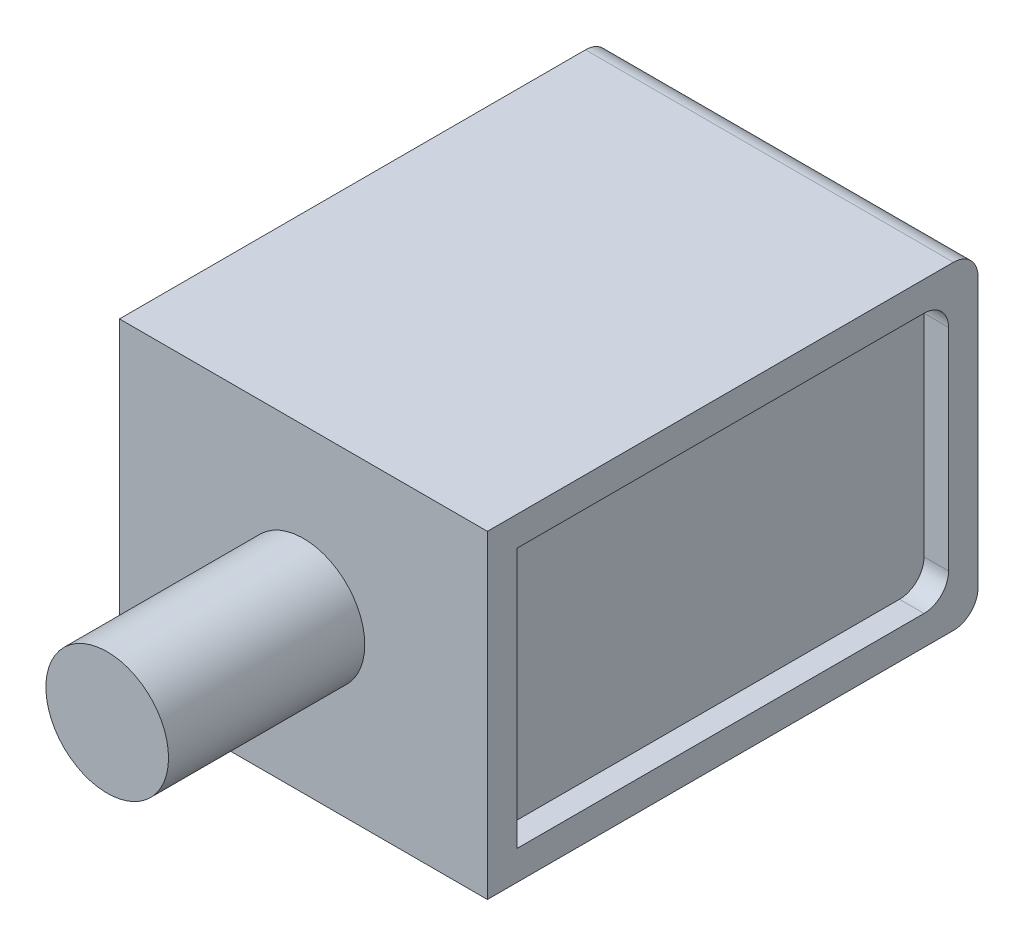
ISO-10303-21;
HEADER;
FILE_DESCRIPTION(('STEP AP214'),'2;1');
FILE_NAME('part.step','',(''),(''),'','','');
FILE_SCHEMA(('AUTOMOTIVE_DESIGN { 1 0 10303 214 1 1 1 1 }'));
ENDSEC;
DATA;
#1=APPLICATION_CONTEXT('core data for automotive mechanical design processes');
#2=APPLICATION_PROTOCOL_DEFINITION('international standard','automotive_design',2000,#1);
#3=PRODUCT_CONTEXT('',#1,'mechanical');
#4=PRODUCT('Part','Part','',(#3));
#5=PRODUCT_RELATED_PRODUCT_CATEGORY('part','',(#4));
#6=PRODUCT_DEFINITION_FORMATION('','',#4);
#7=PRODUCT_DEFINITION_CONTEXT('part definition',#1,'design');
#8=PRODUCT_DEFINITION('design','',#6,#7);
#9=PRODUCT_DEFINITION_SHAPE('','',#8);
#10=(LENGTH_UNIT() NAMED_UNIT(*) SI_UNIT(.MILLI.,.METRE.));
#11=(NAMED_UNIT(*) PLANE_ANGLE_UNIT() SI_UNIT($,.RADIAN.));
#12=(NAMED_UNIT(*) SI_UNIT($,.STERADIAN.) SOLID_ANGLE_UNIT());
#13=UNCERTAINTY_MEASURE_WITH_UNIT(LENGTH_MEASURE(1.E-05),#10,'distance_accuracy_value','');
#14=(GEOMETRIC_REPRESENTATION_CONTEXT(3) GLOBAL_UNCERTAINTY_ASSIGNED_CONTEXT((#13)) GLOBAL_UNIT_ASSIGNED_CONTEXT((#10,
#11,#12)) REPRESENTATION_CONTEXT('',''));
#15=CARTESIAN_POINT('',(0.,0.,0.));
#16=DIRECTION('',(0.,0.,1.));
#17=DIRECTION('',(1.,0.,0.));
#18=AXIS2_PLACEMENT_3D('',#15,#16,#17);
#19=CARTESIAN_POINT('',(-7.5,-6.5,10.));
#20=DIRECTION('',(1.,0.,0.));
#21=DIRECTION('',(0.,1.,0.));
#22=AXIS2_PLACEMENT_3D('',#19,#20,#21);
#23=PLANE('',#22);
#24=DIRECTION('',(0.,-1.,0.));
#25=VECTOR('',#24,1.);
#26=CARTESIAN_POINT('',(-7.5,-6.5,-10.));
#27=LINE('',#26,#25);
#28=CARTESIAN_POINT('',(-7.5,5.5,-10.));
#29=VERTEX_POINT('',#28);
#30=CARTESIAN_POINT('',(-7.5,-5.5,-10.));
#31=VERTEX_POINT('',#30);
#32=EDGE_CURVE('E230',#29,#31,#27,.T.);
#33=ORIENTED_EDGE('',*,*,#32,.T.);
#34=CARTESIAN_POINT('',(-7.5,-5.5,-9.));
#35=DIRECTION('',(1.,0.,0.));
#36=DIRECTION('',(0.,1.,0.));
#37=AXIS2_PLACEMENT_3D('',#34,#35,#36);
#38=CIRCLE('',#37,1.);
#39=CARTESIAN_POINT('',(-7.5,-6.5,-9.));
#40=VERTEX_POINT('',#39);
#41=EDGE_CURVE('E272',#31,#40,#38,.F.);
#42=ORIENTED_EDGE('',*,*,#41,.T.);
#43=DIRECTION('',(0.,0.,-1.));
#44=VECTOR('',#43,1.);
#45=CARTESIAN_POINT('',(-7.5,-6.5,10.));
#46=LINE('',#45,#44);
#47=CARTESIAN_POINT('',(-7.5,-6.5,10.));
#48=VERTEX_POINT('',#47);
#49=EDGE_CURVE('E256',#48,#40,#46,.T.);
#50=ORIENTED_EDGE('',*,*,#49,.F.);
#51=DIRECTION('',(0.,-1.,0.));
#52=VECTOR('',#51,1.);
#53=CARTESIAN_POINT('',(-7.5,-6.5,10.));
#54=LINE('',#53,#52);
#55=CARTESIAN_POINT('',(-7.5,6.5,10.));
#56=VERTEX_POINT('',#55);
#57=EDGE_CURVE('E233',#56,#48,#54,.T.);
#58=ORIENTED_EDGE('',*,*,#57,.F.);
#59=DIRECTION('',(0.,0.,-1.));
#60=VECTOR('',#59,1.);
#61=CARTESIAN_POINT('',(-7.5,6.5,10.));
#62=LINE('',#61,#60);
#63=CARTESIAN_POINT('',(-7.5,6.5,-9.));
#64=VERTEX_POINT('',#63);
#65=EDGE_CURVE('E243',#56,#64,#62,.T.);
#66=ORIENTED_EDGE('',*,*,#65,.T.);
#67=CARTESIAN_POINT('',(-7.5,5.5,-9.));
#68=DIRECTION('',(1.,0.,0.));
#69=DIRECTION('',(0.,1.,0.));
#70=AXIS2_PLACEMENT_3D('',#67,#68,#69);
#71=CIRCLE('',#70,1.);
#72=EDGE_CURVE('E270',#64,#29,#71,.F.);
#73=ORIENTED_EDGE('',*,*,#72,.T.);
#74=EDGE_LOOP('',(#33,#42,#50,#58,#66,#73));
#75=FACE_BOUND('',#74,.T.);
#76=DIRECTION('',(0.,0.,-1.));
#77=VECTOR('',#76,1.);
#78=CARTESIAN_POINT('',(-7.5,-5.3,8.8));
#79=LINE('',#78,#77);
#80=CARTESIAN_POINT('',(-7.5,-5.3,8.8));
#81=VERTEX_POINT('',#80);
#82=CARTESIAN_POINT('',(-7.5,-5.3,-7.8));
#83=VERTEX_POINT('',#82);
#84=EDGE_CURVE('E183',#81,#83,#79,.T.);
#85=ORIENTED_EDGE('',*,*,#84,.T.);
#86=CARTESIAN_POINT('',(-7.5,-4.3,-7.8));
#87=DIRECTION('',(1.,0.,0.));
#88=DIRECTION('',(0.,1.,0.));
#89=AXIS2_PLACEMENT_3D('',#86,#87,#88);
#90=CIRCLE('',#89,1.);
#91=CARTESIAN_POINT('',(-7.5,-4.3,-8.8));
#92=VERTEX_POINT('',#91);
#93=EDGE_CURVE('E305',#83,#92,#90,.T.);
#94=ORIENTED_EDGE('',*,*,#93,.T.);
#95=DIRECTION('',(0.,1.,0.));
#96=VECTOR('',#95,1.);
#97=CARTESIAN_POINT('',(-7.5,-5.3,-8.8));
#98=LINE('',#97,#96);
#99=CARTESIAN_POINT('',(-7.5,4.3,-8.8));
#100=VERTEX_POINT('',#99);
#101=EDGE_CURVE('E197',#92,#100,#98,.T.);
#102=ORIENTED_EDGE('',*,*,#101,.T.);
#103=CARTESIAN_POINT('',(-7.5,4.3,-7.8));
#104=DIRECTION('',(1.,0.,0.));
#105=DIRECTION('',(0.,1.,0.));
#106=AXIS2_PLACEMENT_3D('',#103,#104,#105);
#107=CIRCLE('',#106,1.);
#108=CARTESIAN_POINT('',(-7.5,5.3,-7.8));
#109=VERTEX_POINT('',#108);
#110=EDGE_CURVE('E43',#100,#109,#107,.T.);
#111=ORIENTED_EDGE('',*,*,#110,.T.);
#112=DIRECTION('',(0.,0.,1.));
#113=VECTOR('',#112,1.);
#114=CARTESIAN_POINT('',(-7.5,5.3,-8.8));
#115=LINE('',#114,#113);
#116=CARTESIAN_POINT('',(-7.5,5.3,8.8));
#117=VERTEX_POINT('',#116);
#118=EDGE_CURVE('E193',#109,#117,#115,.T.);
#119=ORIENTED_EDGE('',*,*,#118,.T.);
#120=DIRECTION('',(0.,-1.,0.));
#121=VECTOR('',#120,1.);
#122=CARTESIAN_POINT('',(-7.5,5.3,8.8));
#123=LINE('',#122,#121);
#124=EDGE_CURVE('E201',#117,#81,#123,.T.);
#125=ORIENTED_EDGE('',*,*,#124,.T.);
#126=EDGE_LOOP('',(#85,#94,#102,#111,#119,#125));
#127=FACE_BOUND('',#126,.T.);
#128=ADVANCED_FACE('F39',(#75,#127),#23,.F.);
#129=CARTESIAN_POINT('',(7.5,-6.5,10.));
#130=DIRECTION('',(0.,1.,0.));
#131=DIRECTION('',(-1.,0.,0.));
#132=AXIS2_PLACEMENT_3D('',#129,#130,#131);
#133=PLANE('',#132);
#134=ORIENTED_EDGE('',*,*,#49,.T.);
#135=DIRECTION('',(1.,0.,0.));
#136=VECTOR('',#135,1.);
#137=CARTESIAN_POINT('',(7.5,-6.5,-9.));
#138=LINE('',#137,#136);
#139=CARTESIAN_POINT('',(7.5,-6.5,-9.));
#140=VERTEX_POINT('',#139);
#141=EDGE_CURVE('E259',#40,#140,#138,.T.);
#142=ORIENTED_EDGE('',*,*,#141,.T.);
#143=DIRECTION('',(0.,0.,-1.));
#144=VECTOR('',#143,1.);
#145=CARTESIAN_POINT('',(7.5,-6.5,10.));
#146=LINE('',#145,#144);
#147=CARTESIAN_POINT('',(7.5,-6.5,10.));
#148=VERTEX_POINT('',#147);
#149=EDGE_CURVE('E253',#148,#140,#146,.T.);
#150=ORIENTED_EDGE('',*,*,#149,.F.);
#151=DIRECTION('',(1.,0.,0.));
#152=VECTOR('',#151,1.);
#153=CARTESIAN_POINT('',(7.5,-6.5,10.));
#154=LINE('',#153,#152);
#155=EDGE_CURVE('E236',#48,#148,#154,.T.);
#156=ORIENTED_EDGE('',*,*,#155,.F.);
#157=EDGE_LOOP('',(#134,#142,#150,#156));
#158=FACE_BOUND('',#157,.T.);
#159=ADVANCED_FACE('F323',(#158),#133,.F.);
#160=CARTESIAN_POINT('',(7.5,-6.5,10.));
#161=DIRECTION('',(-1.,0.,0.));
#162=DIRECTION('',(0.,0.,1.));
#163=AXIS2_PLACEMENT_3D('',#160,#161,#162);
#164=PLANE('',#163);
#165=DIRECTION('',(0.,0.,1.));
#166=VECTOR('',#165,1.);
#167=CARTESIAN_POINT('',(7.5,5.3,-8.8));
#168=LINE('',#167,#166);
#169=CARTESIAN_POINT('',(7.5,5.3,-7.8));
#170=VERTEX_POINT('',#169);
#171=CARTESIAN_POINT('',(7.5,5.3,8.8));
#172=VERTEX_POINT('',#171);
#173=EDGE_CURVE('E221',#170,#172,#168,.T.);
#174=ORIENTED_EDGE('',*,*,#173,.F.);
#175=CARTESIAN_POINT('',(7.5,4.3,-7.8));
#176=DIRECTION('',(-1.,0.,0.));
#177=DIRECTION('',(0.,0.,1.));
#178=AXIS2_PLACEMENT_3D('',#175,#176,#177);
#179=CIRCLE('',#178,1.);
#180=CARTESIAN_POINT('',(7.5,4.3,-8.8));
#181=VERTEX_POINT('',#180);
#182=EDGE_CURVE('E293',#170,#181,#179,.T.);
#183=ORIENTED_EDGE('',*,*,#182,.T.);
#184=DIRECTION('',(0.,1.,0.));
#185=VECTOR('',#184,1.);
#186=CARTESIAN_POINT('',(7.5,-5.3,-8.8));
#187=LINE('',#186,#185);
#188=CARTESIAN_POINT('',(7.5,-4.3,-8.8));
#189=VERTEX_POINT('',#188);
#190=EDGE_CURVE('E204',#189,#181,#187,.T.);
#191=ORIENTED_EDGE('',*,*,#190,.F.);
#192=CARTESIAN_POINT('',(7.5,-4.3,-7.8));
#193=DIRECTION('',(-1.,0.,0.));
#194=DIRECTION('',(0.,0.,1.));
#195=AXIS2_PLACEMENT_3D('',#192,#193,#194);
#196=CIRCLE('',#195,1.);
#197=CARTESIAN_POINT('',(7.5,-5.3,-7.8));
#198=VERTEX_POINT('',#197);
#199=EDGE_CURVE('E291',#189,#198,#196,.T.);
#200=ORIENTED_EDGE('',*,*,#199,.T.);
#201=DIRECTION('',(0.,0.,-1.));
#202=VECTOR('',#201,1.);
#203=CARTESIAN_POINT('',(7.5,-5.3,8.8));
#204=LINE('',#203,#202);
#205=CARTESIAN_POINT('',(7.5,-5.3,8.8));
#206=VERTEX_POINT('',#205);
#207=EDGE_CURVE('E210',#206,#198,#204,.T.);
#208=ORIENTED_EDGE('',*,*,#207,.F.);
#209=DIRECTION('',(0.,-1.,0.));
#210=VECTOR('',#209,1.);
#211=CARTESIAN_POINT('',(7.5,5.3,8.8));
#212=LINE('',#211,#210);
#213=EDGE_CURVE('E223',#172,#206,#212,.T.);
#214=ORIENTED_EDGE('',*,*,#213,.F.);
#215=EDGE_LOOP('',(#174,#183,#191,#200,#208,#214));
#216=FACE_BOUND('',#215,.T.);
#217=ORIENTED_EDGE('',*,*,#149,.T.);
#218=CARTESIAN_POINT('',(7.5,-5.5,-9.));
#219=DIRECTION('',(-1.,0.,0.));
#220=DIRECTION('',(0.,0.,1.));
#221=AXIS2_PLACEMENT_3D('',#218,#219,#220);
#222=CIRCLE('',#221,1.);
#223=CARTESIAN_POINT('',(7.5,-5.5,-10.));
#224=VERTEX_POINT('',#223);
#225=EDGE_CURVE('E264',#140,#224,#222,.F.);
#226=ORIENTED_EDGE('',*,*,#225,.T.);
#227=DIRECTION('',(0.,1.,0.));
#228=VECTOR('',#227,1.);
#229=CARTESIAN_POINT('',(7.5,-6.5,-10.));
#230=LINE('',#229,#228);
#231=CARTESIAN_POINT('',(7.5,5.5,-10.));
#232=VERTEX_POINT('',#231);
#233=EDGE_CURVE('E237',#224,#232,#230,.T.);
#234=ORIENTED_EDGE('',*,*,#233,.T.);
#235=CARTESIAN_POINT('',(7.5,5.5,-9.));
#236=DIRECTION('',(-1.,0.,0.));
#237=DIRECTION('',(0.,0.,1.));
#238=AXIS2_PLACEMENT_3D('',#235,#236,#237);
#239=CIRCLE('',#238,1.);
#240=CARTESIAN_POINT('',(7.5,6.5,-9.));
#241=VERTEX_POINT('',#240);
#242=EDGE_CURVE('E262',#232,#241,#239,.F.);
#243=ORIENTED_EDGE('',*,*,#242,.T.);
#244=DIRECTION('',(0.,0.,-1.));
#245=VECTOR('',#244,1.);
#246=CARTESIAN_POINT('',(7.5,6.5,10.));
#247=LINE('',#246,#245);
#248=CARTESIAN_POINT('',(7.5,6.5,10.));
#249=VERTEX_POINT('',#248);
#250=EDGE_CURVE('E250',#249,#241,#247,.T.);
#251=ORIENTED_EDGE('',*,*,#250,.F.);
#252=DIRECTION('',(0.,1.,0.));
#253=VECTOR('',#252,1.);
#254=CARTESIAN_POINT('',(7.5,-6.5,10.));
#255=LINE('',#254,#253);
#256=EDGE_CURVE('E239',#148,#249,#255,.T.);
#257=ORIENTED_EDGE('',*,*,#256,.F.);
#258=EDGE_LOOP('',(#217,#226,#234,#243,#251,#257));
#259=FACE_BOUND('',#258,.T.);
#260=ADVANCED_FACE('F329',(#216,#259),#164,.F.);
#261=CARTESIAN_POINT('',(7.5,6.5,10.));
#262=DIRECTION('',(0.,-1.,0.));
#263=DIRECTION('',(1.,0.,0.));
#264=AXIS2_PLACEMENT_3D('',#261,#262,#263);
#265=PLANE('',#264);
#266=ORIENTED_EDGE('',*,*,#250,.T.);
#267=DIRECTION('',(-1.,0.,0.));
#268=VECTOR('',#267,1.);
#269=CARTESIAN_POINT('',(7.5,6.5,-9.));
#270=LINE('',#269,#268);
#271=EDGE_CURVE('E274',#241,#64,#270,.T.);
#272=ORIENTED_EDGE('',*,*,#271,.T.);
#273=ORIENTED_EDGE('',*,*,#65,.F.);
#274=DIRECTION('',(-1.,0.,0.));
#275=VECTOR('',#274,1.);
#276=CARTESIAN_POINT('',(7.5,6.5,10.));
#277=LINE('',#276,#275);
#278=EDGE_CURVE('E241',#249,#56,#277,.T.);
#279=ORIENTED_EDGE('',*,*,#278,.F.);
#280=EDGE_LOOP('',(#266,#272,#273,#279));
#281=FACE_BOUND('',#280,.T.);
#282=ADVANCED_FACE('F382',(#281),#265,.F.);
#283=CARTESIAN_POINT('',(0.,0.,10.));
#284=DIRECTION('',(0.,0.,1.));
#285=DIRECTION('',(1.,0.,0.));
#286=AXIS2_PLACEMENT_3D('',#283,#284,#285);
#287=PLANE('',#286);
#288=CARTESIAN_POINT('',(0.,0.,10.));
#289=DIRECTION('',(0.,0.,1.));
#290=DIRECTION('',(1.,0.,0.));
#291=AXIS2_PLACEMENT_3D('',#288,#289,#290);
#292=CIRCLE('',#291,2.5);
#293=CARTESIAN_POINT('',(2.5,0.,10.));
#294=VERTEX_POINT('',#293);
#295=EDGE_CURVE('E11',#294,#294,#292,.T.);
#296=ORIENTED_EDGE('',*,*,#295,.F.);
#297=EDGE_LOOP('',(#296));
#298=FACE_BOUND('',#297,.T.);
#299=ORIENTED_EDGE('',*,*,#57,.T.);
#300=ORIENTED_EDGE('',*,*,#155,.T.);
#301=ORIENTED_EDGE('',*,*,#256,.T.);
#302=ORIENTED_EDGE('',*,*,#278,.T.);
#303=EDGE_LOOP('',(#299,#300,#301,#302));
#304=FACE_BOUND('',#303,.T.);
#305=ADVANCED_FACE('F401',(#298,#304),#287,.T.);
#306=CARTESIAN_POINT('',(0.,0.,-10.));
#307=DIRECTION('',(0.,0.,1.));
#308=DIRECTION('',(1.,0.,0.));
#309=AXIS2_PLACEMENT_3D('',#306,#307,#308);
#310=PLANE('',#309);
#311=ORIENTED_EDGE('',*,*,#233,.F.);
#312=DIRECTION('',(1.,0.,0.));
#313=VECTOR('',#312,1.);
#314=CARTESIAN_POINT('',(0.,-5.5,-10.));
#315=LINE('',#314,#313);
#316=EDGE_CURVE('E268',#224,#31,#315,.F.);
#317=ORIENTED_EDGE('',*,*,#316,.T.);
#318=ORIENTED_EDGE('',*,*,#32,.F.);
#319=DIRECTION('',(-1.,0.,0.));
#320=VECTOR('',#319,1.);
#321=CARTESIAN_POINT('',(0.,5.5,-10.));
#322=LINE('',#321,#320);
#323=EDGE_CURVE('E266',#29,#232,#322,.F.);
#324=ORIENTED_EDGE('',*,*,#323,.T.);
#325=EDGE_LOOP('',(#311,#317,#318,#324));
#326=FACE_BOUND('',#325,.T.);
#327=ADVANCED_FACE('F338',(#326),#310,.F.);
#328=CARTESIAN_POINT('',(7.5,-5.5,-9.));
#329=DIRECTION('',(1.,0.,0.));
#330=DIRECTION('',(0.,1.,0.));
#331=AXIS2_PLACEMENT_3D('',#328,#329,#330);
#332=CYLINDRICAL_SURFACE('',#331,1.);
#333=ORIENTED_EDGE('',*,*,#41,.F.);
#334=ORIENTED_EDGE('',*,*,#316,.F.);
#335=ORIENTED_EDGE('',*,*,#225,.F.);
#336=ORIENTED_EDGE('',*,*,#141,.F.);
#337=EDGE_LOOP('',(#333,#334,#335,#336));
#338=FACE_BOUND('',#337,.T.);
#339=ADVANCED_FACE('F334',(#338),#332,.T.);
#340=CARTESIAN_POINT('',(7.5,5.5,-9.));
#341=DIRECTION('',(-1.,0.,0.));
#342=DIRECTION('',(0.,-1.,0.));
#343=AXIS2_PLACEMENT_3D('',#340,#341,#342);
#344=CYLINDRICAL_SURFACE('',#343,1.);
#345=ORIENTED_EDGE('',*,*,#242,.F.);
#346=ORIENTED_EDGE('',*,*,#323,.F.);
#347=ORIENTED_EDGE('',*,*,#72,.F.);
#348=ORIENTED_EDGE('',*,*,#271,.F.);
#349=EDGE_LOOP('',(#345,#346,#347,#348));
#350=FACE_BOUND('',#349,.T.);
#351=ADVANCED_FACE('F337',(#350),#344,.T.);
#352=CARTESIAN_POINT('',(6.5,-5.3,-8.8));
#353=DIRECTION('',(0.,0.,-1.));
#354=DIRECTION('',(-1.,0.,0.));
#355=AXIS2_PLACEMENT_3D('',#352,#353,#354);
#356=PLANE('',#355);
#357=DIRECTION('',(0.,1.,0.));
#358=VECTOR('',#357,1.);
#359=CARTESIAN_POINT('',(6.5,-5.3,-8.8));
#360=LINE('',#359,#358);
#361=CARTESIAN_POINT('',(6.5,-4.3,-8.8));
#362=VERTEX_POINT('',#361);
#363=CARTESIAN_POINT('',(6.5,4.3,-8.8));
#364=VERTEX_POINT('',#363);
#365=EDGE_CURVE('E206',#362,#364,#360,.T.);
#366=ORIENTED_EDGE('',*,*,#365,.F.);
#367=DIRECTION('',(1.,0.,0.));
#368=VECTOR('',#367,1.);
#369=CARTESIAN_POINT('',(7.5,-4.3,-8.8));
#370=LINE('',#369,#368);
#371=EDGE_CURVE('E279',#362,#189,#370,.T.);
#372=ORIENTED_EDGE('',*,*,#371,.T.);
#373=ORIENTED_EDGE('',*,*,#190,.T.);
#374=DIRECTION('',(1.,0.,0.));
#375=VECTOR('',#374,1.);
#376=CARTESIAN_POINT('',(6.5,4.3,-8.8));
#377=LINE('',#376,#375);
#378=EDGE_CURVE('E277',#181,#364,#377,.F.);
#379=ORIENTED_EDGE('',*,*,#378,.T.);
#380=EDGE_LOOP('',(#366,#372,#373,#379));
#381=FACE_BOUND('',#380,.T.);
#382=ADVANCED_FACE('F342',(#381),#356,.F.);
#383=CARTESIAN_POINT('',(6.5,-5.3,8.8));
#384=DIRECTION('',(0.,-1.,0.));
#385=DIRECTION('',(0.,0.,-1.));
#386=AXIS2_PLACEMENT_3D('',#383,#384,#385);
#387=PLANE('',#386);
#388=ORIENTED_EDGE('',*,*,#207,.T.);
#389=DIRECTION('',(1.,0.,0.));
#390=VECTOR('',#389,1.);
#391=CARTESIAN_POINT('',(6.5,-5.3,-7.8));
#392=LINE('',#391,#390);
#393=CARTESIAN_POINT('',(6.5,-5.3,-7.8));
#394=VERTEX_POINT('',#393);
#395=EDGE_CURVE('E282',#198,#394,#392,.F.);
#396=ORIENTED_EDGE('',*,*,#395,.T.);
#397=DIRECTION('',(0.,0.,-1.));
#398=VECTOR('',#397,1.);
#399=CARTESIAN_POINT('',(6.5,-5.3,8.8));
#400=LINE('',#399,#398);
#401=CARTESIAN_POINT('',(6.5,-5.3,8.8));
#402=VERTEX_POINT('',#401);
#403=EDGE_CURVE('E215',#402,#394,#400,.T.);
#404=ORIENTED_EDGE('',*,*,#403,.F.);
#405=DIRECTION('',(1.,0.,0.));
#406=VECTOR('',#405,1.);
#407=CARTESIAN_POINT('',(6.5,-5.3,8.8));
#408=LINE('',#407,#406);
#409=EDGE_CURVE('E228',#402,#206,#408,.T.);
#410=ORIENTED_EDGE('',*,*,#409,.T.);
#411=EDGE_LOOP('',(#388,#396,#404,#410));
#412=FACE_BOUND('',#411,.T.);
#413=ADVANCED_FACE('F373',(#412),#387,.F.);
#414=CARTESIAN_POINT('',(6.5,5.3,8.8));
#415=DIRECTION('',(0.,0.,1.));
#416=DIRECTION('',(1.,0.,0.));
#417=AXIS2_PLACEMENT_3D('',#414,#415,#416);
#418=PLANE('',#417);
#419=ORIENTED_EDGE('',*,*,#213,.T.);
#420=ORIENTED_EDGE('',*,*,#409,.F.);
#421=DIRECTION('',(0.,-1.,0.));
#422=VECTOR('',#421,1.);
#423=CARTESIAN_POINT('',(6.5,5.3,8.8));
#424=LINE('',#423,#422);
#425=CARTESIAN_POINT('',(6.5,5.3,8.8));
#426=VERTEX_POINT('',#425);
#427=EDGE_CURVE('E212',#426,#402,#424,.T.);
#428=ORIENTED_EDGE('',*,*,#427,.F.);
#429=DIRECTION('',(1.,0.,0.));
#430=VECTOR('',#429,1.);
#431=CARTESIAN_POINT('',(6.5,5.3,8.8));
#432=LINE('',#431,#430);
#433=EDGE_CURVE('E218',#426,#172,#432,.T.);
#434=ORIENTED_EDGE('',*,*,#433,.T.);
#435=EDGE_LOOP('',(#419,#420,#428,#434));
#436=FACE_BOUND('',#435,.T.);
#437=ADVANCED_FACE('F369',(#436),#418,.F.);
#438=CARTESIAN_POINT('',(6.5,5.3,-8.8));
#439=DIRECTION('',(0.,1.,0.));
#440=DIRECTION('',(0.,0.,1.));
#441=AXIS2_PLACEMENT_3D('',#438,#439,#440);
#442=PLANE('',#441);
#443=DIRECTION('',(0.,0.,1.));
#444=VECTOR('',#443,1.);
#445=CARTESIAN_POINT('',(6.5,5.3,-8.8));
#446=LINE('',#445,#444);
#447=CARTESIAN_POINT('',(6.5,5.3,-7.8));
#448=VERTEX_POINT('',#447);
#449=EDGE_CURVE('E209',#448,#426,#446,.T.);
#450=ORIENTED_EDGE('',*,*,#449,.F.);
#451=DIRECTION('',(1.,0.,0.));
#452=VECTOR('',#451,1.);
#453=CARTESIAN_POINT('',(7.5,5.3,-7.8));
#454=LINE('',#453,#452);
#455=EDGE_CURVE('E288',#448,#170,#454,.T.);
#456=ORIENTED_EDGE('',*,*,#455,.T.);
#457=ORIENTED_EDGE('',*,*,#173,.T.);
#458=ORIENTED_EDGE('',*,*,#433,.F.);
#459=EDGE_LOOP('',(#450,#456,#457,#458));
#460=FACE_BOUND('',#459,.T.);
#461=ADVANCED_FACE('F364',(#460),#442,.F.);
#462=CARTESIAN_POINT('',(6.5,0.,0.));
#463=DIRECTION('',(1.,0.,0.));
#464=DIRECTION('',(0.,0.,-1.));
#465=AXIS2_PLACEMENT_3D('',#462,#463,#464);
#466=PLANE('',#465);
#467=ORIENTED_EDGE('',*,*,#403,.T.);
#468=CARTESIAN_POINT('',(6.5,-4.3,-7.8));
#469=DIRECTION('',(1.,0.,0.));
#470=DIRECTION('',(0.,0.,-1.));
#471=AXIS2_PLACEMENT_3D('',#468,#469,#470);
#472=CIRCLE('',#471,1.);
#473=EDGE_CURVE('E286',#394,#362,#472,.T.);
#474=ORIENTED_EDGE('',*,*,#473,.T.);
#475=ORIENTED_EDGE('',*,*,#365,.T.);
#476=CARTESIAN_POINT('',(6.5,4.3,-7.8));
#477=DIRECTION('',(1.,0.,0.));
#478=DIRECTION('',(0.,0.,-1.));
#479=AXIS2_PLACEMENT_3D('',#476,#477,#478);
#480=CIRCLE('',#479,1.);
#481=EDGE_CURVE('E284',#364,#448,#480,.T.);
#482=ORIENTED_EDGE('',*,*,#481,.T.);
#483=ORIENTED_EDGE('',*,*,#449,.T.);
#484=ORIENTED_EDGE('',*,*,#427,.T.);
#485=EDGE_LOOP('',(#467,#474,#475,#482,#483,#484));
#486=FACE_BOUND('',#485,.T.);
#487=ADVANCED_FACE('F347',(#486),#466,.T.);
#488=CARTESIAN_POINT('',(6.5,-4.3,-7.8));
#489=DIRECTION('',(-1.,0.,0.));
#490=DIRECTION('',(0.,0.,1.));
#491=AXIS2_PLACEMENT_3D('',#488,#489,#490);
#492=CYLINDRICAL_SURFACE('',#491,1.);
#493=ORIENTED_EDGE('',*,*,#473,.F.);
#494=ORIENTED_EDGE('',*,*,#395,.F.);
#495=ORIENTED_EDGE('',*,*,#199,.F.);
#496=ORIENTED_EDGE('',*,*,#371,.F.);
#497=EDGE_LOOP('',(#493,#494,#495,#496));
#498=FACE_BOUND('',#497,.T.);
#499=ADVANCED_FACE('F344',(#498),#492,.F.);
#500=CARTESIAN_POINT('',(6.5,4.3,-7.8));
#501=DIRECTION('',(-1.,0.,0.));
#502=DIRECTION('',(0.,0.,1.));
#503=AXIS2_PLACEMENT_3D('',#500,#501,#502);
#504=CYLINDRICAL_SURFACE('',#503,1.);
#505=ORIENTED_EDGE('',*,*,#481,.F.);
#506=ORIENTED_EDGE('',*,*,#378,.F.);
#507=ORIENTED_EDGE('',*,*,#182,.F.);
#508=ORIENTED_EDGE('',*,*,#455,.F.);
#509=EDGE_LOOP('',(#505,#506,#507,#508));
#510=FACE_BOUND('',#509,.T.);
#511=ADVANCED_FACE('F346',(#510),#504,.F.);
#512=CARTESIAN_POINT('',(-6.5,-5.3,-8.8));
#513=DIRECTION('',(0.,0.,1.));
#514=DIRECTION('',(1.,0.,0.));
#515=AXIS2_PLACEMENT_3D('',#512,#513,#514);
#516=PLANE('',#515);
#517=ORIENTED_EDGE('',*,*,#101,.F.);
#518=DIRECTION('',(-1.,0.,0.));
#519=VECTOR('',#518,1.);
#520=CARTESIAN_POINT('',(-6.5,-4.3,-8.8));
#521=LINE('',#520,#519);
#522=CARTESIAN_POINT('',(-6.5,-4.3,-8.8));
#523=VERTEX_POINT('',#522);
#524=EDGE_CURVE('E300',#92,#523,#521,.F.);
#525=ORIENTED_EDGE('',*,*,#524,.T.);
#526=DIRECTION('',(0.,1.,0.));
#527=VECTOR('',#526,1.);
#528=CARTESIAN_POINT('',(-6.5,-5.3,-8.8));
#529=LINE('',#528,#527);
#530=CARTESIAN_POINT('',(-6.5,4.3,-8.8));
#531=VERTEX_POINT('',#530);
#532=EDGE_CURVE('E190',#523,#531,#529,.T.);
#533=ORIENTED_EDGE('',*,*,#532,.T.);
#534=DIRECTION('',(-1.,0.,0.));
#535=VECTOR('',#534,1.);
#536=CARTESIAN_POINT('',(-7.5,4.3,-8.8));
#537=LINE('',#536,#535);
#538=EDGE_CURVE('E297',#531,#100,#537,.T.);
#539=ORIENTED_EDGE('',*,*,#538,.T.);
#540=EDGE_LOOP('',(#517,#525,#533,#539));
#541=FACE_BOUND('',#540,.T.);
#542=ADVANCED_FACE('F310',(#541),#516,.T.);
#543=CARTESIAN_POINT('',(-6.5,5.3,-8.8));
#544=DIRECTION('',(0.,-1.,0.));
#545=DIRECTION('',(0.,0.,-1.));
#546=AXIS2_PLACEMENT_3D('',#543,#544,#545);
#547=PLANE('',#546);
#548=ORIENTED_EDGE('',*,*,#118,.F.);
#549=DIRECTION('',(-1.,0.,0.));
#550=VECTOR('',#549,1.);
#551=CARTESIAN_POINT('',(-6.5,5.3,-7.8));
#552=LINE('',#551,#550);
#553=CARTESIAN_POINT('',(-6.5,5.3,-7.8));
#554=VERTEX_POINT('',#553);
#555=EDGE_CURVE('E61',#109,#554,#552,.F.);
#556=ORIENTED_EDGE('',*,*,#555,.T.);
#557=DIRECTION('',(0.,0.,1.));
#558=VECTOR('',#557,1.);
#559=CARTESIAN_POINT('',(-6.5,5.3,-8.8));
#560=LINE('',#559,#558);
#561=CARTESIAN_POINT('',(-6.5,5.3,8.8));
#562=VERTEX_POINT('',#561);
#563=EDGE_CURVE('E174',#554,#562,#560,.T.);
#564=ORIENTED_EDGE('',*,*,#563,.T.);
#565=DIRECTION('',(-1.,0.,0.));
#566=VECTOR('',#565,1.);
#567=CARTESIAN_POINT('',(-6.5,5.3,8.8));
#568=LINE('',#567,#566);
#569=EDGE_CURVE('E171',#562,#117,#568,.T.);
#570=ORIENTED_EDGE('',*,*,#569,.T.);
#571=EDGE_LOOP('',(#548,#556,#564,#570));
#572=FACE_BOUND('',#571,.T.);
#573=ADVANCED_FACE('F354',(#572),#547,.T.);
#574=CARTESIAN_POINT('',(-6.5,5.3,8.8));
#575=DIRECTION('',(0.,0.,-1.));
#576=DIRECTION('',(-1.,0.,0.));
#577=AXIS2_PLACEMENT_3D('',#574,#575,#576);
#578=PLANE('',#577);
#579=ORIENTED_EDGE('',*,*,#124,.F.);
#580=ORIENTED_EDGE('',*,*,#569,.F.);
#581=DIRECTION('',(0.,-1.,0.));
#582=VECTOR('',#581,1.);
#583=CARTESIAN_POINT('',(-6.5,5.3,8.8));
#584=LINE('',#583,#582);
#585=CARTESIAN_POINT('',(-6.5,-5.3,8.8));
#586=VERTEX_POINT('',#585);
#587=EDGE_CURVE('E164',#562,#586,#584,.T.);
#588=ORIENTED_EDGE('',*,*,#587,.T.);
#589=DIRECTION('',(-1.,0.,0.));
#590=VECTOR('',#589,1.);
#591=CARTESIAN_POINT('',(-6.5,-5.3,8.8));
#592=LINE('',#591,#590);
#593=EDGE_CURVE('E168',#586,#81,#592,.T.);
#594=ORIENTED_EDGE('',*,*,#593,.T.);
#595=EDGE_LOOP('',(#579,#580,#588,#594));
#596=FACE_BOUND('',#595,.T.);
#597=ADVANCED_FACE('F167',(#596),#578,.T.);
#598=CARTESIAN_POINT('',(-6.5,-5.3,8.8));
#599=DIRECTION('',(0.,1.,0.));
#600=DIRECTION('',(0.,0.,1.));
#601=AXIS2_PLACEMENT_3D('',#598,#599,#600);
#602=PLANE('',#601);
#603=DIRECTION('',(0.,0.,-1.));
#604=VECTOR('',#603,1.);
#605=CARTESIAN_POINT('',(-6.5,-5.3,8.8));
#606=LINE('',#605,#604);
#607=CARTESIAN_POINT('',(-6.5,-5.3,-7.8));
#608=VERTEX_POINT('',#607);
#609=EDGE_CURVE('E175',#586,#608,#606,.T.);
#610=ORIENTED_EDGE('',*,*,#609,.T.);
#611=DIRECTION('',(-1.,0.,0.));
#612=VECTOR('',#611,1.);
#613=CARTESIAN_POINT('',(-7.5,-5.3,-7.8));
#614=LINE('',#613,#612);
#615=EDGE_CURVE('E295',#608,#83,#614,.T.);
#616=ORIENTED_EDGE('',*,*,#615,.T.);
#617=ORIENTED_EDGE('',*,*,#84,.F.);
#618=ORIENTED_EDGE('',*,*,#593,.F.);
#619=EDGE_LOOP('',(#610,#616,#617,#618));
#620=FACE_BOUND('',#619,.T.);
#621=ADVANCED_FACE('F179',(#620),#602,.T.);
#622=CARTESIAN_POINT('',(-6.5,0.,0.));
#623=DIRECTION('',(-1.,0.,0.));
#624=DIRECTION('',(0.,0.,-1.));
#625=AXIS2_PLACEMENT_3D('',#622,#623,#624);
#626=PLANE('',#625);
#627=ORIENTED_EDGE('',*,*,#532,.F.);
#628=CARTESIAN_POINT('',(-6.5,-4.3,-7.8));
#629=DIRECTION('',(-1.,0.,0.));
#630=DIRECTION('',(0.,0.,1.));
#631=AXIS2_PLACEMENT_3D('',#628,#629,#630);
#632=CIRCLE('',#631,1.);
#633=EDGE_CURVE('E189',#523,#608,#632,.T.);
#634=ORIENTED_EDGE('',*,*,#633,.T.);
#635=ORIENTED_EDGE('',*,*,#609,.F.);
#636=ORIENTED_EDGE('',*,*,#587,.F.);
#637=ORIENTED_EDGE('',*,*,#563,.F.);
#638=CARTESIAN_POINT('',(-6.5,4.3,-7.8));
#639=DIRECTION('',(-1.,0.,0.));
#640=DIRECTION('',(0.,0.,1.));
#641=AXIS2_PLACEMENT_3D('',#638,#639,#640);
#642=CIRCLE('',#641,1.);
#643=EDGE_CURVE('E302',#554,#531,#642,.T.);
#644=ORIENTED_EDGE('',*,*,#643,.T.);
#645=EDGE_LOOP('',(#627,#634,#635,#636,#637,#644));
#646=FACE_BOUND('',#645,.T.);
#647=ADVANCED_FACE('F187',(#646),#626,.T.);
#648=CARTESIAN_POINT('',(-6.5,-4.3,-7.8));
#649=DIRECTION('',(1.,0.,0.));
#650=DIRECTION('',(0.,0.,-1.));
#651=AXIS2_PLACEMENT_3D('',#648,#649,#650);
#652=CYLINDRICAL_SURFACE('',#651,1.);
#653=ORIENTED_EDGE('',*,*,#633,.F.);
#654=ORIENTED_EDGE('',*,*,#524,.F.);
#655=ORIENTED_EDGE('',*,*,#93,.F.);
#656=ORIENTED_EDGE('',*,*,#615,.F.);
#657=EDGE_LOOP('',(#653,#654,#655,#656));
#658=FACE_BOUND('',#657,.T.);
#659=ADVANCED_FACE('F312',(#658),#652,.F.);
#660=CARTESIAN_POINT('',(-6.5,4.3,-7.8));
#661=DIRECTION('',(1.,0.,0.));
#662=DIRECTION('',(0.,0.,-1.));
#663=AXIS2_PLACEMENT_3D('',#660,#661,#662);
#664=CYLINDRICAL_SURFACE('',#663,1.);
#665=ORIENTED_EDGE('',*,*,#643,.F.);
#666=ORIENTED_EDGE('',*,*,#555,.F.);
#667=ORIENTED_EDGE('',*,*,#110,.F.);
#668=ORIENTED_EDGE('',*,*,#538,.F.);
#669=EDGE_LOOP('',(#665,#666,#667,#668));
#670=FACE_BOUND('',#669,.T.);
#671=ADVANCED_FACE('F41',(#670),#664,.F.);
#672=CARTESIAN_POINT('',(0.,0.,18.));
#673=DIRECTION('',(0.,0.,-1.));
#674=DIRECTION('',(-1.,0.,0.));
#675=AXIS2_PLACEMENT_3D('',#672,#673,#674);
#676=CYLINDRICAL_SURFACE('',#675,2.5);
#677=CARTESIAN_POINT('',(0.,0.,18.));
#678=DIRECTION('',(0.,0.,1.));
#679=DIRECTION('',(1.,0.,0.));
#680=AXIS2_PLACEMENT_3D('',#677,#678,#679);
#681=CIRCLE('',#680,2.5);
#682=CARTESIAN_POINT('',(2.5,0.,18.));
#683=VERTEX_POINT('',#682);
#684=EDGE_CURVE('E199',#683,#683,#681,.T.);
#685=ORIENTED_EDGE('',*,*,#684,.F.);
#686=EDGE_LOOP('',(#685));
#687=FACE_BOUND('',#686,.T.);
#688=ORIENTED_EDGE('',*,*,#295,.T.);
#689=EDGE_LOOP('',(#688));
#690=FACE_BOUND('',#689,.T.);
#691=ADVANCED_FACE('F318',(#687,#690),#676,.T.);
#692=CARTESIAN_POINT('',(0.,0.,18.));
#693=DIRECTION('',(0.,0.,1.));
#694=DIRECTION('',(1.,0.,0.));
#695=AXIS2_PLACEMENT_3D('',#692,#693,#694);
#696=PLANE('',#695);
#697=ORIENTED_EDGE('',*,*,#684,.T.);
#698=EDGE_LOOP('',(#697));
#699=FACE_BOUND('',#698,.T.);
#700=ADVANCED_FACE('F431',(#699),#696,.T.);
#701=CLOSED_SHELL('',(#128,#159,#260,#282,#305,#327,#339,#351,#382,#413,#437,#461,#487,#499,
#511,#542,#573,#597,#621,#647,#659,#671,#691,#700));
#702=MANIFOLD_SOLID_BREP('B2',#701);
#703=ADVANCED_BREP_SHAPE_REPRESENTATION('',(#18,#702),#14);
#704=SHAPE_DEFINITION_REPRESENTATION(#9,#703);
ENDSEC;
END-ISO-10303-21;
